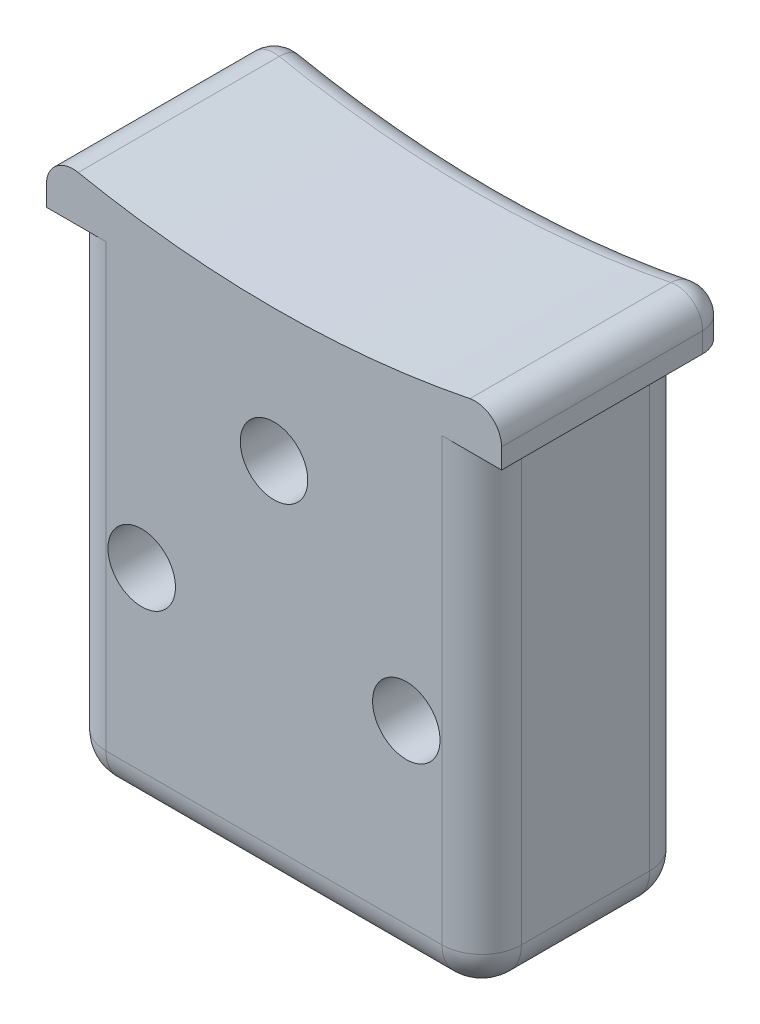
ISO-10303-21;
HEADER;
FILE_DESCRIPTION(('STEP AP214'),'2;1');
FILE_NAME('part.step','',(''),(''),'','','');
FILE_SCHEMA(('AUTOMOTIVE_DESIGN { 1 0 10303 214 1 1 1 1 }'));
ENDSEC;
DATA;
#1=APPLICATION_CONTEXT('core data for automotive mechanical design processes');
#2=APPLICATION_PROTOCOL_DEFINITION('international standard','automotive_design',2000,#1);
#3=PRODUCT_CONTEXT('',#1,'mechanical');
#4=PRODUCT('Part','Part','',(#3));
#5=PRODUCT_RELATED_PRODUCT_CATEGORY('part','',(#4));
#6=PRODUCT_DEFINITION_FORMATION('','',#4);
#7=PRODUCT_DEFINITION_CONTEXT('part definition',#1,'design');
#8=PRODUCT_DEFINITION('design','',#6,#7);
#9=PRODUCT_DEFINITION_SHAPE('','',#8);
#10=(LENGTH_UNIT() NAMED_UNIT(*) SI_UNIT(.MILLI.,.METRE.));
#11=(NAMED_UNIT(*) PLANE_ANGLE_UNIT() SI_UNIT($,.RADIAN.));
#12=(NAMED_UNIT(*) SI_UNIT($,.STERADIAN.) SOLID_ANGLE_UNIT());
#13=UNCERTAINTY_MEASURE_WITH_UNIT(LENGTH_MEASURE(1.E-05),#10,'distance_accuracy_value','');
#14=(GEOMETRIC_REPRESENTATION_CONTEXT(3) GLOBAL_UNCERTAINTY_ASSIGNED_CONTEXT((#13)) GLOBAL_UNIT_ASSIGNED_CONTEXT((#10,
#11,#12)) REPRESENTATION_CONTEXT('',''));
#15=CARTESIAN_POINT('',(0.,0.,0.));
#16=DIRECTION('',(0.,0.,1.));
#17=DIRECTION('',(1.,0.,0.));
#18=AXIS2_PLACEMENT_3D('',#15,#16,#17);
#19=CARTESIAN_POINT('',(0.,0.,-17.2));
#20=DIRECTION('',(0.,0.,-1.));
#21=DIRECTION('',(-1.,0.,0.));
#22=AXIS2_PLACEMENT_3D('',#19,#20,#21);
#23=PLANE('',#22);
#24=CARTESIAN_POINT('',(15.7,113.338325587649,-17.2));
#25=DIRECTION('',(0.,0.,-1.));
#26=DIRECTION('',(-1.,0.,0.));
#27=AXIS2_PLACEMENT_3D('',#24,#25,#26);
#28=CIRCLE('',#27,77.);
#29=CARTESIAN_POINT('',(15.7,36.3383255876489,-17.2));
#30=VERTEX_POINT('',#29);
#31=CARTESIAN_POINT('',(30.9,37.8534926740099,-17.2));
#32=VERTEX_POINT('',#31);
#33=EDGE_CURVE('E267',#30,#32,#28,.F.);
#34=ORIENTED_EDGE('',*,*,#33,.T.);
#35=DIRECTION('',(0.,-1.,0.));
#36=VECTOR('',#35,1.);
#37=CARTESIAN_POINT('',(30.9,0.,-17.2));
#38=LINE('',#37,#36);
#39=CARTESIAN_POINT('',(30.9,36.3383255876489,-17.2));
#40=VERTEX_POINT('',#39);
#41=EDGE_CURVE('E269',#32,#40,#38,.T.);
#42=ORIENTED_EDGE('',*,*,#41,.T.);
#43=DIRECTION('',(1.,0.,0.));
#44=VECTOR('',#43,1.);
#45=CARTESIAN_POINT('',(0.,36.3383255876489,-17.2));
#46=LINE('',#45,#44);
#47=EDGE_CURVE('E230',#30,#40,#46,.T.);
#48=ORIENTED_EDGE('',*,*,#47,.F.);
#49=EDGE_LOOP('',(#34,#42,#48));
#50=FACE_BOUND('',#49,.T.);
#51=ADVANCED_FACE('F58',(#50),#23,.T.);
#52=CARTESIAN_POINT('',(0.,40.,-15.7));
#53=DIRECTION('',(0.,0.,-1.));
#54=DIRECTION('',(-1.,0.,0.));
#55=AXIS2_PLACEMENT_3D('',#52,#53,#54);
#56=PLANE('',#55);
#57=CARTESIAN_POINT('',(25.7,16.3383255876489,-15.7));
#58=DIRECTION('',(0.,0.,-1.));
#59=DIRECTION('',(-1.,0.,0.));
#60=AXIS2_PLACEMENT_3D('',#57,#58,#59);
#61=CIRCLE('',#60,2.55);
#62=CARTESIAN_POINT('',(23.15,16.3383255876489,-15.7));
#63=VERTEX_POINT('',#62);
#64=EDGE_CURVE('E237',#63,#63,#61,.T.);
#65=ORIENTED_EDGE('',*,*,#64,.F.);
#66=EDGE_LOOP('',(#65));
#67=FACE_BOUND('',#66,.T.);
#68=CARTESIAN_POINT('',(5.69999999999999,16.3383255876489,-15.7));
#69=DIRECTION('',(0.,0.,-1.));
#70=DIRECTION('',(-1.,0.,0.));
#71=AXIS2_PLACEMENT_3D('',#68,#69,#70);
#72=CIRCLE('',#71,2.55);
#73=CARTESIAN_POINT('',(3.15,16.3383255876489,-15.7));
#74=VERTEX_POINT('',#73);
#75=EDGE_CURVE('E241',#74,#74,#72,.T.);
#76=ORIENTED_EDGE('',*,*,#75,.F.);
#77=EDGE_LOOP('',(#76));
#78=FACE_BOUND('',#77,.T.);
#79=CARTESIAN_POINT('',(15.7,28.3383255876489,-15.7));
#80=DIRECTION('',(0.,0.,-1.));
#81=DIRECTION('',(-1.,0.,0.));
#82=AXIS2_PLACEMENT_3D('',#79,#80,#81);
#83=CIRCLE('',#82,2.55);
#84=CARTESIAN_POINT('',(13.15,28.3383255876489,-15.7));
#85=VERTEX_POINT('',#84);
#86=EDGE_CURVE('E234',#85,#85,#83,.T.);
#87=ORIENTED_EDGE('',*,*,#86,.F.);
#88=EDGE_LOOP('',(#87));
#89=FACE_BOUND('',#88,.T.);
#90=DIRECTION('',(1.,0.,0.));
#91=VECTOR('',#90,1.);
#92=CARTESIAN_POINT('',(0.,3.,-15.7));
#93=LINE('',#92,#91);
#94=CARTESIAN_POINT('',(28.4,3.,-15.7));
#95=VERTEX_POINT('',#94);
#96=CARTESIAN_POINT('',(3.,3.,-15.7));
#97=VERTEX_POINT('',#96);
#98=EDGE_CURVE('E310',#95,#97,#93,.F.);
#99=ORIENTED_EDGE('',*,*,#98,.T.);
#100=DIRECTION('',(0.,-1.,0.));
#101=VECTOR('',#100,1.);
#102=CARTESIAN_POINT('',(3.,40.,-15.7));
#103=LINE('',#102,#101);
#104=CARTESIAN_POINT('',(3.,36.3383255876489,-15.7));
#105=VERTEX_POINT('',#104);
#106=EDGE_CURVE('E312',#97,#105,#103,.F.);
#107=ORIENTED_EDGE('',*,*,#106,.T.);
#108=DIRECTION('',(1.,0.,0.));
#109=VECTOR('',#108,1.);
#110=CARTESIAN_POINT('',(0.,36.3383255876489,-15.7));
#111=LINE('',#110,#109);
#112=CARTESIAN_POINT('',(28.4,36.3383255876489,-15.7));
#113=VERTEX_POINT('',#112);
#114=EDGE_CURVE('E231',#105,#113,#111,.T.);
#115=ORIENTED_EDGE('',*,*,#114,.T.);
#116=DIRECTION('',(0.,-1.,0.));
#117=VECTOR('',#116,1.);
#118=CARTESIAN_POINT('',(28.4,0.,-15.7));
#119=LINE('',#118,#117);
#120=EDGE_CURVE('E308',#113,#95,#119,.T.);
#121=ORIENTED_EDGE('',*,*,#120,.T.);
#122=EDGE_LOOP('',(#99,#107,#115,#121));
#123=FACE_BOUND('',#122,.T.);
#124=ADVANCED_FACE('F463',(#67,#78,#89,#123),#56,.T.);
#125=CARTESIAN_POINT('',(0.,40.,0.));
#126=DIRECTION('',(-1.,0.,0.));
#127=DIRECTION('',(0.,0.,1.));
#128=AXIS2_PLACEMENT_3D('',#125,#126,#127);
#129=PLANE('',#128);
#130=DIRECTION('',(0.,0.,-1.));
#131=VECTOR('',#130,1.);
#132=CARTESIAN_POINT('',(0.,36.3383255876489,2.45671245254708));
#133=LINE('',#132,#131);
#134=CARTESIAN_POINT('',(0.,36.3383255876489,-3.));
#135=VERTEX_POINT('',#134);
#136=CARTESIAN_POINT('',(0.,36.3383255876489,-12.7));
#137=VERTEX_POINT('',#136);
#138=EDGE_CURVE('E208',#135,#137,#133,.T.);
#139=ORIENTED_EDGE('',*,*,#138,.T.);
#140=DIRECTION('',(0.,-1.,0.));
#141=VECTOR('',#140,1.);
#142=CARTESIAN_POINT('',(0.,40.,-12.7));
#143=LINE('',#142,#141);
#144=CARTESIAN_POINT('',(0.,3.,-12.7));
#145=VERTEX_POINT('',#144);
#146=EDGE_CURVE('E305',#137,#145,#143,.T.);
#147=ORIENTED_EDGE('',*,*,#146,.T.);
#148=DIRECTION('',(0.,0.,-1.));
#149=VECTOR('',#148,1.);
#150=CARTESIAN_POINT('',(0.,3.,0.));
#151=LINE('',#150,#149);
#152=CARTESIAN_POINT('',(0.,3.,-3.));
#153=VERTEX_POINT('',#152);
#154=EDGE_CURVE('E303',#145,#153,#151,.F.);
#155=ORIENTED_EDGE('',*,*,#154,.T.);
#156=DIRECTION('',(0.,-1.,0.));
#157=VECTOR('',#156,1.);
#158=CARTESIAN_POINT('',(0.,36.3383255876489,-3.));
#159=LINE('',#158,#157);
#160=EDGE_CURVE('E285',#153,#135,#159,.F.);
#161=ORIENTED_EDGE('',*,*,#160,.T.);
#162=EDGE_LOOP('',(#139,#147,#155,#161));
#163=FACE_BOUND('',#162,.T.);
#164=ADVANCED_FACE('F468',(#163),#129,.T.);
#165=CARTESIAN_POINT('',(0.,40.,0.));
#166=DIRECTION('',(0.,0.,-1.));
#167=DIRECTION('',(-1.,0.,0.));
#168=AXIS2_PLACEMENT_3D('',#165,#166,#167);
#169=PLANE('',#168);
#170=DIRECTION('',(1.,0.,0.));
#171=VECTOR('',#170,1.);
#172=CARTESIAN_POINT('',(0.,36.3383255876489,0.));
#173=LINE('',#172,#171);
#174=CARTESIAN_POINT('',(-1.5,36.3383255876489,0.));
#175=VERTEX_POINT('',#174);
#176=CARTESIAN_POINT('',(3.,36.3383255876489,0.));
#177=VERTEX_POINT('',#176);
#178=EDGE_CURVE('E191',#175,#177,#173,.T.);
#179=ORIENTED_EDGE('',*,*,#178,.T.);
#180=DIRECTION('',(0.,-1.,0.));
#181=VECTOR('',#180,1.);
#182=CARTESIAN_POINT('',(3.,0.,0.));
#183=LINE('',#182,#181);
#184=CARTESIAN_POINT('',(3.,3.,0.));
#185=VERTEX_POINT('',#184);
#186=EDGE_CURVE('E328',#177,#185,#183,.T.);
#187=ORIENTED_EDGE('',*,*,#186,.T.);
#188=DIRECTION('',(1.,0.,0.));
#189=VECTOR('',#188,1.);
#190=CARTESIAN_POINT('',(0.,3.,0.));
#191=LINE('',#190,#189);
#192=CARTESIAN_POINT('',(28.4,3.,0.));
#193=VERTEX_POINT('',#192);
#194=EDGE_CURVE('E326',#185,#193,#191,.T.);
#195=ORIENTED_EDGE('',*,*,#194,.T.);
#196=DIRECTION('',(0.,-1.,0.));
#197=VECTOR('',#196,1.);
#198=CARTESIAN_POINT('',(28.4,40.,0.));
#199=LINE('',#198,#197);
#200=CARTESIAN_POINT('',(28.4,36.3383255876489,0.));
#201=VERTEX_POINT('',#200);
#202=EDGE_CURVE('E323',#193,#201,#199,.F.);
#203=ORIENTED_EDGE('',*,*,#202,.T.);
#204=DIRECTION('',(1.,0.,0.));
#205=VECTOR('',#204,1.);
#206=CARTESIAN_POINT('',(0.,36.3383255876489,0.));
#207=LINE('',#206,#205);
#208=CARTESIAN_POINT('',(32.9,36.3383255876489,0.));
#209=VERTEX_POINT('',#208);
#210=EDGE_CURVE('E226',#201,#209,#207,.T.);
#211=ORIENTED_EDGE('',*,*,#210,.T.);
#212=DIRECTION('',(0.,-1.,0.));
#213=VECTOR('',#212,1.);
#214=CARTESIAN_POINT('',(32.9,0.,0.));
#215=LINE('',#214,#213);
#216=CARTESIAN_POINT('',(32.9,37.8534926740099,0.));
#217=VERTEX_POINT('',#216);
#218=EDGE_CURVE('E199',#217,#209,#215,.T.);
#219=ORIENTED_EDGE('',*,*,#218,.F.);
#220=CARTESIAN_POINT('',(30.9,37.8534926740099,0.));
#221=DIRECTION('',(0.,0.,-1.));
#222=DIRECTION('',(-1.,0.,0.));
#223=AXIS2_PLACEMENT_3D('',#220,#221,#222);
#224=CIRCLE('',#223,2.);
#225=CARTESIAN_POINT('',(30.5051948051948,39.8141376847537,0.));
#226=VERTEX_POINT('',#225);
#227=EDGE_CURVE('E276',#217,#226,#224,.F.);
#228=ORIENTED_EDGE('',*,*,#227,.T.);
#229=CARTESIAN_POINT('',(15.7,113.338325587649,0.));
#230=DIRECTION('',(0.,0.,-1.));
#231=DIRECTION('',(-1.,0.,0.));
#232=AXIS2_PLACEMENT_3D('',#229,#230,#231);
#233=CIRCLE('',#232,75.);
#234=CARTESIAN_POINT('',(0.89480519480519,39.8141376847537,0.));
#235=VERTEX_POINT('',#234);
#236=EDGE_CURVE('E246',#226,#235,#233,.T.);
#237=ORIENTED_EDGE('',*,*,#236,.T.);
#238=CARTESIAN_POINT('',(0.499999999999999,37.8534926740099,0.));
#239=DIRECTION('',(0.,0.,-1.));
#240=DIRECTION('',(-1.,0.,0.));
#241=AXIS2_PLACEMENT_3D('',#238,#239,#240);
#242=CIRCLE('',#241,2.);
#243=CARTESIAN_POINT('',(-1.5,37.8534926740099,0.));
#244=VERTEX_POINT('',#243);
#245=EDGE_CURVE('E195',#235,#244,#242,.F.);
#246=ORIENTED_EDGE('',*,*,#245,.T.);
#247=DIRECTION('',(0.,-1.,0.));
#248=VECTOR('',#247,1.);
#249=CARTESIAN_POINT('',(-1.5,0.,0.));
#250=LINE('',#249,#248);
#251=EDGE_CURVE('E186',#244,#175,#250,.T.);
#252=ORIENTED_EDGE('',*,*,#251,.T.);
#253=EDGE_LOOP('',(#179,#187,#195,#203,#211,#219,#228,#237,#246,#252));
#254=FACE_BOUND('',#253,.T.);
#255=CARTESIAN_POINT('',(25.7,16.3383255876489,0.));
#256=DIRECTION('',(0.,0.,-1.));
#257=DIRECTION('',(-1.,0.,0.));
#258=AXIS2_PLACEMENT_3D('',#255,#256,#257);
#259=CIRCLE('',#258,2.55);
#260=CARTESIAN_POINT('',(23.15,16.3383255876489,0.));
#261=VERTEX_POINT('',#260);
#262=EDGE_CURVE('E248',#261,#261,#259,.T.);
#263=ORIENTED_EDGE('',*,*,#262,.T.);
#264=EDGE_LOOP('',(#263));
#265=FACE_BOUND('',#264,.T.);
#266=CARTESIAN_POINT('',(5.69999999999999,16.3383255876489,0.));
#267=DIRECTION('',(0.,0.,-1.));
#268=DIRECTION('',(-1.,0.,0.));
#269=AXIS2_PLACEMENT_3D('',#266,#267,#268);
#270=CIRCLE('',#269,2.55);
#271=CARTESIAN_POINT('',(3.15,16.3383255876489,0.));
#272=VERTEX_POINT('',#271);
#273=EDGE_CURVE('E252',#272,#272,#270,.T.);
#274=ORIENTED_EDGE('',*,*,#273,.T.);
#275=EDGE_LOOP('',(#274));
#276=FACE_BOUND('',#275,.T.);
#277=CARTESIAN_POINT('',(15.7,28.3383255876489,0.));
#278=DIRECTION('',(0.,0.,-1.));
#279=DIRECTION('',(-1.,0.,0.));
#280=AXIS2_PLACEMENT_3D('',#277,#278,#279);
#281=CIRCLE('',#280,2.55);
#282=CARTESIAN_POINT('',(13.15,28.3383255876489,0.));
#283=VERTEX_POINT('',#282);
#284=EDGE_CURVE('E240',#283,#283,#281,.T.);
#285=ORIENTED_EDGE('',*,*,#284,.T.);
#286=EDGE_LOOP('',(#285));
#287=FACE_BOUND('',#286,.T.);
#288=ADVANCED_FACE('F188',(#254,#265,#276,#287),#169,.F.);
#289=CARTESIAN_POINT('',(31.4,40.,0.));
#290=DIRECTION('',(-1.,0.,0.));
#291=DIRECTION('',(0.,0.,1.));
#292=AXIS2_PLACEMENT_3D('',#289,#290,#291);
#293=PLANE('',#292);
#294=DIRECTION('',(0.,0.,-1.));
#295=VECTOR('',#294,1.);
#296=CARTESIAN_POINT('',(31.4,3.,0.));
#297=LINE('',#296,#295);
#298=CARTESIAN_POINT('',(31.4,3.,-3.));
#299=VERTEX_POINT('',#298);
#300=CARTESIAN_POINT('',(31.4,3.,-12.7));
#301=VERTEX_POINT('',#300);
#302=EDGE_CURVE('E75',#299,#301,#297,.T.);
#303=ORIENTED_EDGE('',*,*,#302,.T.);
#304=DIRECTION('',(0.,-1.,0.));
#305=VECTOR('',#304,1.);
#306=CARTESIAN_POINT('',(31.4,36.3383255876489,-12.7));
#307=LINE('',#306,#305);
#308=CARTESIAN_POINT('',(31.4,36.3383255876489,-12.7));
#309=VERTEX_POINT('',#308);
#310=EDGE_CURVE('E332',#301,#309,#307,.F.);
#311=ORIENTED_EDGE('',*,*,#310,.T.);
#312=DIRECTION('',(0.,0.,-1.));
#313=VECTOR('',#312,1.);
#314=CARTESIAN_POINT('',(31.4,36.3383255876489,2.45671245254708));
#315=LINE('',#314,#313);
#316=CARTESIAN_POINT('',(31.4,36.3383255876489,-3.));
#317=VERTEX_POINT('',#316);
#318=EDGE_CURVE('E219',#317,#309,#315,.T.);
#319=ORIENTED_EDGE('',*,*,#318,.F.);
#320=DIRECTION('',(0.,-1.,0.));
#321=VECTOR('',#320,1.);
#322=CARTESIAN_POINT('',(31.4,40.,-3.));
#323=LINE('',#322,#321);
#324=EDGE_CURVE('E80',#317,#299,#323,.T.);
#325=ORIENTED_EDGE('',*,*,#324,.T.);
#326=EDGE_LOOP('',(#303,#311,#319,#325));
#327=FACE_BOUND('',#326,.T.);
#328=ADVANCED_FACE('F410',(#327),#293,.F.);
#329=CARTESIAN_POINT('',(0.,0.,0.));
#330=DIRECTION('',(0.,1.,0.));
#331=DIRECTION('',(0.,0.,1.));
#332=AXIS2_PLACEMENT_3D('',#329,#330,#331);
#333=PLANE('',#332);
#334=DIRECTION('',(1.,0.,0.));
#335=VECTOR('',#334,1.);
#336=CARTESIAN_POINT('',(0.,0.,-3.));
#337=LINE('',#336,#335);
#338=CARTESIAN_POINT('',(28.4,0.,-3.));
#339=VERTEX_POINT('',#338);
#340=CARTESIAN_POINT('',(3.,0.,-3.));
#341=VERTEX_POINT('',#340);
#342=EDGE_CURVE('E318',#339,#341,#337,.F.);
#343=ORIENTED_EDGE('',*,*,#342,.T.);
#344=DIRECTION('',(0.,0.,-1.));
#345=VECTOR('',#344,1.);
#346=CARTESIAN_POINT('',(3.,0.,-15.7));
#347=LINE('',#346,#345);
#348=CARTESIAN_POINT('',(3.,0.,-12.7));
#349=VERTEX_POINT('',#348);
#350=EDGE_CURVE('E320',#341,#349,#347,.T.);
#351=ORIENTED_EDGE('',*,*,#350,.T.);
#352=DIRECTION('',(1.,0.,0.));
#353=VECTOR('',#352,1.);
#354=CARTESIAN_POINT('',(31.4,0.,-12.7));
#355=LINE('',#354,#353);
#356=CARTESIAN_POINT('',(28.4,0.,-12.7));
#357=VERTEX_POINT('',#356);
#358=EDGE_CURVE('E316',#349,#357,#355,.T.);
#359=ORIENTED_EDGE('',*,*,#358,.T.);
#360=DIRECTION('',(0.,0.,-1.));
#361=VECTOR('',#360,1.);
#362=CARTESIAN_POINT('',(28.4,0.,0.));
#363=LINE('',#362,#361);
#364=EDGE_CURVE('E314',#357,#339,#363,.F.);
#365=ORIENTED_EDGE('',*,*,#364,.T.);
#366=EDGE_LOOP('',(#343,#351,#359,#365));
#367=FACE_BOUND('',#366,.T.);
#368=ADVANCED_FACE('F396',(#367),#333,.F.);
#369=CARTESIAN_POINT('',(15.7,113.338325587649,0.));
#370=DIRECTION('',(0.,0.,-1.));
#371=DIRECTION('',(-1.,0.,0.));
#372=AXIS2_PLACEMENT_3D('',#369,#370,#371);
#373=CYLINDRICAL_SURFACE('',#372,75.);
#374=ORIENTED_EDGE('',*,*,#236,.F.);
#375=DIRECTION('',(0.,0.,-1.));
#376=VECTOR('',#375,1.);
#377=CARTESIAN_POINT('',(30.5051948051948,39.8141376847537,0.));
#378=LINE('',#377,#376);
#379=CARTESIAN_POINT('',(30.5051948051948,39.8141376847537,-15.2));
#380=VERTEX_POINT('',#379);
#381=EDGE_CURVE('E261',#226,#380,#378,.T.);
#382=ORIENTED_EDGE('',*,*,#381,.T.);
#383=CARTESIAN_POINT('',(15.7,113.338325587649,-15.2));
#384=DIRECTION('',(0.,0.,-1.));
#385=DIRECTION('',(-1.,0.,0.));
#386=AXIS2_PLACEMENT_3D('',#383,#384,#385);
#387=CIRCLE('',#386,75.);
#388=CARTESIAN_POINT('',(0.894805194805193,39.8141376847537,-15.2));
#389=VERTEX_POINT('',#388);
#390=EDGE_CURVE('E258',#380,#389,#387,.T.);
#391=ORIENTED_EDGE('',*,*,#390,.T.);
#392=DIRECTION('',(0.,0.,-1.));
#393=VECTOR('',#392,1.);
#394=CARTESIAN_POINT('',(0.89480519480519,39.8141376847537,0.));
#395=LINE('',#394,#393);
#396=EDGE_CURVE('E198',#389,#235,#395,.F.);
#397=ORIENTED_EDGE('',*,*,#396,.T.);
#398=EDGE_LOOP('',(#374,#382,#391,#397));
#399=FACE_BOUND('',#398,.T.);
#400=ADVANCED_FACE('F432',(#399),#373,.F.);
#401=CARTESIAN_POINT('',(-1.5,0.,0.));
#402=DIRECTION('',(1.,0.,0.));
#403=DIRECTION('',(0.,0.,-1.));
#404=AXIS2_PLACEMENT_3D('',#401,#402,#403);
#405=PLANE('',#404);
#406=ORIENTED_EDGE('',*,*,#251,.F.);
#407=DIRECTION('',(0.,0.,-1.));
#408=VECTOR('',#407,1.);
#409=CARTESIAN_POINT('',(-1.5,37.8534926740099,0.));
#410=LINE('',#409,#408);
#411=CARTESIAN_POINT('',(-1.5,37.8534926740099,-15.2));
#412=VERTEX_POINT('',#411);
#413=EDGE_CURVE('E279',#244,#412,#410,.T.);
#414=ORIENTED_EDGE('',*,*,#413,.T.);
#415=DIRECTION('',(0.,-1.,0.));
#416=VECTOR('',#415,1.);
#417=CARTESIAN_POINT('',(-1.5,36.3383255876489,-15.2));
#418=LINE('',#417,#416);
#419=CARTESIAN_POINT('',(-1.5,36.3383255876489,-15.2));
#420=VERTEX_POINT('',#419);
#421=EDGE_CURVE('E205',#412,#420,#418,.T.);
#422=ORIENTED_EDGE('',*,*,#421,.T.);
#423=DIRECTION('',(0.,0.,-1.));
#424=VECTOR('',#423,1.);
#425=CARTESIAN_POINT('',(-1.5,36.3383255876489,2.45671245254708));
#426=LINE('',#425,#424);
#427=EDGE_CURVE('E202',#175,#420,#426,.T.);
#428=ORIENTED_EDGE('',*,*,#427,.F.);
#429=EDGE_LOOP('',(#406,#414,#422,#428));
#430=FACE_BOUND('',#429,.T.);
#431=ADVANCED_FACE('F203',(#430),#405,.F.);
#432=CARTESIAN_POINT('',(32.9,0.,0.));
#433=DIRECTION('',(1.,0.,0.));
#434=DIRECTION('',(0.,0.,-1.));
#435=AXIS2_PLACEMENT_3D('',#432,#433,#434);
#436=PLANE('',#435);
#437=DIRECTION('',(0.,-1.,0.));
#438=VECTOR('',#437,1.);
#439=CARTESIAN_POINT('',(32.9,0.,-15.2));
#440=LINE('',#439,#438);
#441=CARTESIAN_POINT('',(32.9,36.3383255876489,-15.2));
#442=VERTEX_POINT('',#441);
#443=CARTESIAN_POINT('',(32.9,37.8534926740099,-15.2));
#444=VERTEX_POINT('',#443);
#445=EDGE_CURVE('E271',#442,#444,#440,.F.);
#446=ORIENTED_EDGE('',*,*,#445,.T.);
#447=DIRECTION('',(0.,0.,1.));
#448=VECTOR('',#447,1.);
#449=CARTESIAN_POINT('',(32.9,37.8534926740099,0.));
#450=LINE('',#449,#448);
#451=EDGE_CURVE('E273',#444,#217,#450,.T.);
#452=ORIENTED_EDGE('',*,*,#451,.T.);
#453=ORIENTED_EDGE('',*,*,#218,.T.);
#454=DIRECTION('',(0.,0.,-1.));
#455=VECTOR('',#454,1.);
#456=CARTESIAN_POINT('',(32.9,36.3383255876489,2.45671245254708));
#457=LINE('',#456,#455);
#458=EDGE_CURVE('E216',#209,#442,#457,.T.);
#459=ORIENTED_EDGE('',*,*,#458,.T.);
#460=EDGE_LOOP('',(#446,#452,#453,#459));
#461=FACE_BOUND('',#460,.T.);
#462=ADVANCED_FACE('F415',(#461),#436,.T.);
#463=DIRECTION('',(0.,-1.,0.));
#464=VECTOR('',#463,1.);
#465=CARTESIAN_POINT('',(0.499999999999999,40.3372297054637,-17.2));
#466=LINE('',#465,#464);
#467=CARTESIAN_POINT('',(0.499999999999999,36.3383255876489,-17.2));
#468=VERTEX_POINT('',#467);
#469=CARTESIAN_POINT('',(0.499999999999999,37.8534926740099,-17.2));
#470=VERTEX_POINT('',#469);
#471=EDGE_CURVE('E263',#468,#470,#466,.F.);
#472=ORIENTED_EDGE('',*,*,#471,.T.);
#473=CARTESIAN_POINT('',(15.7,113.338325587649,-17.2));
#474=DIRECTION('',(0.,0.,-1.));
#475=DIRECTION('',(-1.,0.,0.));
#476=AXIS2_PLACEMENT_3D('',#473,#474,#475);
#477=CIRCLE('',#476,77.);
#478=EDGE_CURVE('E265',#470,#30,#477,.F.);
#479=ORIENTED_EDGE('',*,*,#478,.T.);
#480=EDGE_CURVE('E235',#468,#30,#46,.T.);
#481=ORIENTED_EDGE('',*,*,#480,.F.);
#482=EDGE_LOOP('',(#472,#479,#481));
#483=FACE_BOUND('',#482,.T.);
#484=ADVANCED_FACE('F446',(#483),#23,.T.);
#485=CARTESIAN_POINT('',(15.7,28.3383255876489,6.80000000000001));
#486=DIRECTION('',(0.,0.,-1.));
#487=DIRECTION('',(-1.,0.,0.));
#488=AXIS2_PLACEMENT_3D('',#485,#486,#487);
#489=CYLINDRICAL_SURFACE('',#488,2.55);
#490=ORIENTED_EDGE('',*,*,#86,.T.);
#491=EDGE_LOOP('',(#490));
#492=FACE_BOUND('',#491,.T.);
#493=ORIENTED_EDGE('',*,*,#284,.F.);
#494=EDGE_LOOP('',(#493));
#495=FACE_BOUND('',#494,.T.);
#496=ADVANCED_FACE('F474',(#492,#495),#489,.F.);
#497=CARTESIAN_POINT('',(5.69999999999999,16.3383255876489,6.80000000000001));
#498=DIRECTION('',(0.,0.,-1.));
#499=DIRECTION('',(-1.,0.,0.));
#500=AXIS2_PLACEMENT_3D('',#497,#498,#499);
#501=CYLINDRICAL_SURFACE('',#500,2.55);
#502=ORIENTED_EDGE('',*,*,#75,.T.);
#503=EDGE_LOOP('',(#502));
#504=FACE_BOUND('',#503,.T.);
#505=ORIENTED_EDGE('',*,*,#273,.F.);
#506=EDGE_LOOP('',(#505));
#507=FACE_BOUND('',#506,.T.);
#508=ADVANCED_FACE('F479',(#504,#507),#501,.F.);
#509=CARTESIAN_POINT('',(25.7,16.3383255876489,6.80000000000001));
#510=DIRECTION('',(0.,0.,-1.));
#511=DIRECTION('',(-1.,0.,0.));
#512=AXIS2_PLACEMENT_3D('',#509,#510,#511);
#513=CYLINDRICAL_SURFACE('',#512,2.55);
#514=ORIENTED_EDGE('',*,*,#64,.T.);
#515=EDGE_LOOP('',(#514));
#516=FACE_BOUND('',#515,.T.);
#517=ORIENTED_EDGE('',*,*,#262,.F.);
#518=EDGE_LOOP('',(#517));
#519=FACE_BOUND('',#518,.T.);
#520=ADVANCED_FACE('F612',(#516,#519),#513,.F.);
#521=CARTESIAN_POINT('',(0.,36.3383255876489,-32.9831096066841));
#522=DIRECTION('',(0.,-1.,0.));
#523=DIRECTION('',(0.,0.,-1.));
#524=AXIS2_PLACEMENT_3D('',#521,#522,#523);
#525=PLANE('',#524);
#526=ORIENTED_EDGE('',*,*,#47,.T.);
#527=CARTESIAN_POINT('',(30.9,36.3383255876489,-15.2));
#528=DIRECTION('',(0.,-1.,0.));
#529=DIRECTION('',(0.,0.,-1.));
#530=AXIS2_PLACEMENT_3D('',#527,#528,#529);
#531=CIRCLE('',#530,2.);
#532=EDGE_CURVE('E283',#40,#442,#531,.T.);
#533=ORIENTED_EDGE('',*,*,#532,.T.);
#534=ORIENTED_EDGE('',*,*,#458,.F.);
#535=ORIENTED_EDGE('',*,*,#210,.F.);
#536=CARTESIAN_POINT('',(28.4,36.3383255876489,-3.));
#537=DIRECTION('',(0.,-1.,0.));
#538=DIRECTION('',(0.,0.,-1.));
#539=AXIS2_PLACEMENT_3D('',#536,#537,#538);
#540=CIRCLE('',#539,3.);
#541=EDGE_CURVE('E12',#201,#317,#540,.F.);
#542=ORIENTED_EDGE('',*,*,#541,.T.);
#543=ORIENTED_EDGE('',*,*,#318,.T.);
#544=CARTESIAN_POINT('',(28.4,36.3383255876489,-12.7));
#545=DIRECTION('',(0.,-1.,0.));
#546=DIRECTION('',(0.,0.,-1.));
#547=AXIS2_PLACEMENT_3D('',#544,#545,#546);
#548=CIRCLE('',#547,3.);
#549=EDGE_CURVE('E67',#309,#113,#548,.F.);
#550=ORIENTED_EDGE('',*,*,#549,.T.);
#551=ORIENTED_EDGE('',*,*,#114,.F.);
#552=CARTESIAN_POINT('',(3.,36.3383255876489,-12.7));
#553=DIRECTION('',(0.,-1.,0.));
#554=DIRECTION('',(0.,0.,-1.));
#555=AXIS2_PLACEMENT_3D('',#552,#553,#554);
#556=CIRCLE('',#555,3.);
#557=EDGE_CURVE('E334',#105,#137,#556,.F.);
#558=ORIENTED_EDGE('',*,*,#557,.T.);
#559=ORIENTED_EDGE('',*,*,#138,.F.);
#560=CARTESIAN_POINT('',(3.,36.3383255876489,-3.));
#561=DIRECTION('',(0.,-1.,0.));
#562=DIRECTION('',(0.,0.,-1.));
#563=AXIS2_PLACEMENT_3D('',#560,#561,#562);
#564=CIRCLE('',#563,3.);
#565=EDGE_CURVE('E214',#135,#177,#564,.F.);
#566=ORIENTED_EDGE('',*,*,#565,.T.);
#567=ORIENTED_EDGE('',*,*,#178,.F.);
#568=ORIENTED_EDGE('',*,*,#427,.T.);
#569=CARTESIAN_POINT('',(0.499999999999999,36.3383255876489,-15.2));
#570=DIRECTION('',(0.,-1.,0.));
#571=DIRECTION('',(0.,0.,-1.));
#572=AXIS2_PLACEMENT_3D('',#569,#570,#571);
#573=CIRCLE('',#572,2.);
#574=EDGE_CURVE('E281',#420,#468,#573,.T.);
#575=ORIENTED_EDGE('',*,*,#574,.T.);
#576=ORIENTED_EDGE('',*,*,#480,.T.);
#577=EDGE_LOOP('',(#526,#533,#534,#535,#542,#543,#550,#551,#558,#559,#566,#567,#568,#575,#576));
#578=FACE_BOUND('',#577,.T.);
#579=ADVANCED_FACE('F211',(#578),#525,.T.);
#580=CARTESIAN_POINT('',(30.9,0.,-15.2));
#581=DIRECTION('',(0.,-1.,0.));
#582=DIRECTION('',(0.,0.,-1.));
#583=AXIS2_PLACEMENT_3D('',#580,#581,#582);
#584=CYLINDRICAL_SURFACE('',#583,2.);
#585=ORIENTED_EDGE('',*,*,#532,.F.);
#586=ORIENTED_EDGE('',*,*,#41,.F.);
#587=CARTESIAN_POINT('',(30.9,37.8534926740099,-15.2));
#588=DIRECTION('',(0.,1.,0.));
#589=DIRECTION('',(0.,0.,1.));
#590=AXIS2_PLACEMENT_3D('',#587,#588,#589);
#591=CIRCLE('',#590,2.);
#592=EDGE_CURVE('E224',#444,#32,#591,.T.);
#593=ORIENTED_EDGE('',*,*,#592,.F.);
#594=ORIENTED_EDGE('',*,*,#445,.F.);
#595=EDGE_LOOP('',(#585,#586,#593,#594));
#596=FACE_BOUND('',#595,.T.);
#597=ADVANCED_FACE('F419',(#596),#584,.T.);
#598=CARTESIAN_POINT('',(30.9,37.8534926740099,0.));
#599=DIRECTION('',(0.,0.,-1.));
#600=DIRECTION('',(-1.,0.,0.));
#601=AXIS2_PLACEMENT_3D('',#598,#599,#600);
#602=CYLINDRICAL_SURFACE('',#601,2.);
#603=ORIENTED_EDGE('',*,*,#227,.F.);
#604=ORIENTED_EDGE('',*,*,#451,.F.);
#605=CARTESIAN_POINT('',(30.9,37.8534926740099,-15.2));
#606=DIRECTION('',(0.,0.,-1.));
#607=DIRECTION('',(-1.,0.,0.));
#608=AXIS2_PLACEMENT_3D('',#605,#606,#607);
#609=CIRCLE('',#608,2.);
#610=EDGE_CURVE('E297',#380,#444,#609,.T.);
#611=ORIENTED_EDGE('',*,*,#610,.F.);
#612=ORIENTED_EDGE('',*,*,#381,.F.);
#613=EDGE_LOOP('',(#603,#604,#611,#612));
#614=FACE_BOUND('',#613,.T.);
#615=ADVANCED_FACE('F429',(#614),#602,.T.);
#616=CARTESIAN_POINT('',(0.499999999999999,37.8534926740099,0.));
#617=DIRECTION('',(0.,0.,-1.));
#618=DIRECTION('',(-1.,0.,0.));
#619=AXIS2_PLACEMENT_3D('',#616,#617,#618);
#620=CYLINDRICAL_SURFACE('',#619,2.);
#621=ORIENTED_EDGE('',*,*,#245,.F.);
#622=ORIENTED_EDGE('',*,*,#396,.F.);
#623=CARTESIAN_POINT('',(0.499999999999999,37.8534926740099,-15.2));
#624=DIRECTION('',(0.,0.,-1.));
#625=DIRECTION('',(-1.,0.,0.));
#626=AXIS2_PLACEMENT_3D('',#623,#624,#625);
#627=CIRCLE('',#626,2.);
#628=EDGE_CURVE('E294',#412,#389,#627,.T.);
#629=ORIENTED_EDGE('',*,*,#628,.F.);
#630=ORIENTED_EDGE('',*,*,#413,.F.);
#631=EDGE_LOOP('',(#621,#622,#629,#630));
#632=FACE_BOUND('',#631,.T.);
#633=ADVANCED_FACE('F436',(#632),#620,.T.);
#634=CARTESIAN_POINT('',(0.499999999999999,0.,-15.2));
#635=DIRECTION('',(0.,1.,0.));
#636=DIRECTION('',(0.,0.,1.));
#637=AXIS2_PLACEMENT_3D('',#634,#635,#636);
#638=CYLINDRICAL_SURFACE('',#637,2.);
#639=ORIENTED_EDGE('',*,*,#574,.F.);
#640=ORIENTED_EDGE('',*,*,#421,.F.);
#641=CARTESIAN_POINT('',(0.499999999999999,37.8534926740099,-15.2));
#642=DIRECTION('',(0.,1.,0.));
#643=DIRECTION('',(-1.,0.,0.));
#644=AXIS2_PLACEMENT_3D('',#641,#642,#643);
#645=CIRCLE('',#644,2.);
#646=EDGE_CURVE('E291',#470,#412,#645,.T.);
#647=ORIENTED_EDGE('',*,*,#646,.F.);
#648=ORIENTED_EDGE('',*,*,#471,.F.);
#649=EDGE_LOOP('',(#639,#640,#647,#648));
#650=FACE_BOUND('',#649,.T.);
#651=ADVANCED_FACE('F439',(#650),#638,.T.);
#652=CARTESIAN_POINT('',(30.9,37.8534926740099,-15.2));
#653=DIRECTION('',(0.,0.,-1.));
#654=DIRECTION('',(0.,1.,0.));
#655=AXIS2_PLACEMENT_3D('',#652,#653,#654);
#656=SPHERICAL_SURFACE('',#655,2.);
#657=ORIENTED_EDGE('',*,*,#610,.T.);
#658=ORIENTED_EDGE('',*,*,#592,.T.);
#659=CARTESIAN_POINT('',(30.9,37.8534926740099,-15.2));
#660=DIRECTION('',(0.980322505371935,0.197402597402596,0.));
#661=DIRECTION('',(-0.197402597402596,0.980322505371936,0.));
#662=AXIS2_PLACEMENT_3D('',#659,#660,#661);
#663=CIRCLE('',#662,2.);
#664=EDGE_CURVE('E288',#380,#32,#663,.F.);
#665=ORIENTED_EDGE('',*,*,#664,.F.);
#666=EDGE_LOOP('',(#657,#658,#665));
#667=FACE_BOUND('',#666,.T.);
#668=ADVANCED_FACE('F424',(#667),#656,.T.);
#669=CARTESIAN_POINT('',(0.499999999999999,37.8534926740099,-15.2));
#670=DIRECTION('',(0.,0.,-1.));
#671=DIRECTION('',(0.,1.,0.));
#672=AXIS2_PLACEMENT_3D('',#669,#670,#671);
#673=SPHERICAL_SURFACE('',#672,2.);
#674=ORIENTED_EDGE('',*,*,#646,.T.);
#675=ORIENTED_EDGE('',*,*,#628,.T.);
#676=CARTESIAN_POINT('',(0.499999999999998,37.8534926740099,-15.2));
#677=DIRECTION('',(-0.980322505371935,0.197402597402598,0.));
#678=DIRECTION('',(-0.197402597402598,-0.980322505371935,0.));
#679=AXIS2_PLACEMENT_3D('',#676,#677,#678);
#680=CIRCLE('',#679,2.);
#681=EDGE_CURVE('E286',#470,#389,#680,.F.);
#682=ORIENTED_EDGE('',*,*,#681,.F.);
#683=EDGE_LOOP('',(#674,#675,#682));
#684=FACE_BOUND('',#683,.T.);
#685=ADVANCED_FACE('F453',(#684),#673,.T.);
#686=CARTESIAN_POINT('',(15.7,113.338325587649,-15.2));
#687=DIRECTION('',(0.,0.,-1.));
#688=DIRECTION('',(-1.,0.,0.));
#689=AXIS2_PLACEMENT_3D('',#686,#687,#688);
#690=TOROIDAL_SURFACE('',#689,77.,2.);
#691=ORIENTED_EDGE('',*,*,#33,.F.);
#692=ORIENTED_EDGE('',*,*,#478,.F.);
#693=ORIENTED_EDGE('',*,*,#681,.T.);
#694=ORIENTED_EDGE('',*,*,#390,.F.);
#695=ORIENTED_EDGE('',*,*,#664,.T.);
#696=EDGE_LOOP('',(#691,#692,#693,#694,#695));
#697=FACE_BOUND('',#696,.T.);
#698=ADVANCED_FACE('F451',(#697),#690,.T.);
#699=CARTESIAN_POINT('',(28.4,40.,-3.));
#700=DIRECTION('',(0.,-1.,0.));
#701=DIRECTION('',(0.,0.,-1.));
#702=AXIS2_PLACEMENT_3D('',#699,#700,#701);
#703=CYLINDRICAL_SURFACE('',#702,3.);
#704=CARTESIAN_POINT('',(28.4,3.,-3.));
#705=DIRECTION('',(0.,-1.,0.));
#706=DIRECTION('',(0.,0.,-1.));
#707=AXIS2_PLACEMENT_3D('',#704,#705,#706);
#708=CIRCLE('',#707,3.);
#709=EDGE_CURVE('E62',#299,#193,#708,.T.);
#710=ORIENTED_EDGE('',*,*,#709,.F.);
#711=ORIENTED_EDGE('',*,*,#324,.F.);
#712=ORIENTED_EDGE('',*,*,#541,.F.);
#713=ORIENTED_EDGE('',*,*,#202,.F.);
#714=EDGE_LOOP('',(#710,#711,#712,#713));
#715=FACE_BOUND('',#714,.T.);
#716=ADVANCED_FACE('F60',(#715),#703,.T.);
#717=CARTESIAN_POINT('',(28.4,3.,-3.));
#718=DIRECTION('',(0.,0.,1.));
#719=DIRECTION('',(0.,-1.,0.));
#720=AXIS2_PLACEMENT_3D('',#717,#718,#719);
#721=SPHERICAL_SURFACE('',#720,3.);
#722=CARTESIAN_POINT('',(28.4,3.,-3.));
#723=DIRECTION('',(0.,0.,1.));
#724=DIRECTION('',(1.,0.,0.));
#725=AXIS2_PLACEMENT_3D('',#722,#723,#724);
#726=CIRCLE('',#725,3.);
#727=EDGE_CURVE('E363',#299,#339,#726,.F.);
#728=ORIENTED_EDGE('',*,*,#727,.F.);
#729=ORIENTED_EDGE('',*,*,#709,.T.);
#730=CARTESIAN_POINT('',(28.4,3.,-3.));
#731=DIRECTION('',(1.,0.,0.));
#732=DIRECTION('',(0.,0.,-1.));
#733=AXIS2_PLACEMENT_3D('',#730,#731,#732);
#734=CIRCLE('',#733,3.);
#735=EDGE_CURVE('E365',#339,#193,#734,.F.);
#736=ORIENTED_EDGE('',*,*,#735,.F.);
#737=EDGE_LOOP('',(#728,#729,#736));
#738=FACE_BOUND('',#737,.T.);
#739=ADVANCED_FACE('F374',(#738),#721,.T.);
#740=CARTESIAN_POINT('',(3.,40.,-3.));
#741=DIRECTION('',(0.,1.,0.));
#742=DIRECTION('',(0.,0.,1.));
#743=AXIS2_PLACEMENT_3D('',#740,#741,#742);
#744=CYLINDRICAL_SURFACE('',#743,3.);
#745=ORIENTED_EDGE('',*,*,#565,.F.);
#746=ORIENTED_EDGE('',*,*,#160,.F.);
#747=CARTESIAN_POINT('',(3.,3.,-3.));
#748=DIRECTION('',(0.,-1.,0.));
#749=DIRECTION('',(1.,0.,0.));
#750=AXIS2_PLACEMENT_3D('',#747,#748,#749);
#751=CIRCLE('',#750,3.);
#752=EDGE_CURVE('E360',#185,#153,#751,.T.);
#753=ORIENTED_EDGE('',*,*,#752,.F.);
#754=ORIENTED_EDGE('',*,*,#186,.F.);
#755=EDGE_LOOP('',(#745,#746,#753,#754));
#756=FACE_BOUND('',#755,.T.);
#757=ADVANCED_FACE('F386',(#756),#744,.T.);
#758=CARTESIAN_POINT('',(0.,3.,-3.));
#759=DIRECTION('',(1.,0.,0.));
#760=DIRECTION('',(0.,0.,-1.));
#761=AXIS2_PLACEMENT_3D('',#758,#759,#760);
#762=CYLINDRICAL_SURFACE('',#761,3.);
#763=ORIENTED_EDGE('',*,*,#735,.T.);
#764=ORIENTED_EDGE('',*,*,#194,.F.);
#765=CARTESIAN_POINT('',(3.,3.,-3.));
#766=DIRECTION('',(-1.,0.,0.));
#767=DIRECTION('',(0.,0.,1.));
#768=AXIS2_PLACEMENT_3D('',#765,#766,#767);
#769=CIRCLE('',#768,3.);
#770=EDGE_CURVE('E357',#341,#185,#769,.T.);
#771=ORIENTED_EDGE('',*,*,#770,.F.);
#772=ORIENTED_EDGE('',*,*,#342,.F.);
#773=EDGE_LOOP('',(#763,#764,#771,#772));
#774=FACE_BOUND('',#773,.T.);
#775=ADVANCED_FACE('F382',(#774),#762,.T.);
#776=CARTESIAN_POINT('',(28.4,3.,0.));
#777=DIRECTION('',(0.,0.,-1.));
#778=DIRECTION('',(-1.,0.,0.));
#779=AXIS2_PLACEMENT_3D('',#776,#777,#778);
#780=CYLINDRICAL_SURFACE('',#779,3.);
#781=ORIENTED_EDGE('',*,*,#727,.T.);
#782=ORIENTED_EDGE('',*,*,#364,.F.);
#783=CARTESIAN_POINT('',(28.4,3.,-12.7));
#784=DIRECTION('',(0.,0.,-1.));
#785=DIRECTION('',(-1.,0.,0.));
#786=AXIS2_PLACEMENT_3D('',#783,#784,#785);
#787=CIRCLE('',#786,3.);
#788=EDGE_CURVE('E354',#301,#357,#787,.T.);
#789=ORIENTED_EDGE('',*,*,#788,.F.);
#790=ORIENTED_EDGE('',*,*,#302,.F.);
#791=EDGE_LOOP('',(#781,#782,#789,#790));
#792=FACE_BOUND('',#791,.T.);
#793=ADVANCED_FACE('F400',(#792),#780,.T.);
#794=CARTESIAN_POINT('',(28.4,40.,-12.7));
#795=DIRECTION('',(0.,1.,0.));
#796=DIRECTION('',(0.,0.,1.));
#797=AXIS2_PLACEMENT_3D('',#794,#795,#796);
#798=CYLINDRICAL_SURFACE('',#797,3.);
#799=ORIENTED_EDGE('',*,*,#549,.F.);
#800=ORIENTED_EDGE('',*,*,#310,.F.);
#801=CARTESIAN_POINT('',(28.4,3.,-12.7));
#802=DIRECTION('',(0.,-1.,0.));
#803=DIRECTION('',(1.,0.,0.));
#804=AXIS2_PLACEMENT_3D('',#801,#802,#803);
#805=CIRCLE('',#804,3.);
#806=EDGE_CURVE('E351',#95,#301,#805,.T.);
#807=ORIENTED_EDGE('',*,*,#806,.F.);
#808=ORIENTED_EDGE('',*,*,#120,.F.);
#809=EDGE_LOOP('',(#799,#800,#807,#808));
#810=FACE_BOUND('',#809,.T.);
#811=ADVANCED_FACE('F409',(#810),#798,.T.);
#812=CARTESIAN_POINT('',(3.,3.,-3.));
#813=DIRECTION('',(0.,0.,1.));
#814=DIRECTION('',(0.,-1.,0.));
#815=AXIS2_PLACEMENT_3D('',#812,#813,#814);
#816=SPHERICAL_SURFACE('',#815,3.);
#817=ORIENTED_EDGE('',*,*,#770,.T.);
#818=ORIENTED_EDGE('',*,*,#752,.T.);
#819=CARTESIAN_POINT('',(3.,3.,-3.));
#820=DIRECTION('',(0.,0.,1.));
#821=DIRECTION('',(1.,0.,0.));
#822=AXIS2_PLACEMENT_3D('',#819,#820,#821);
#823=CIRCLE('',#822,3.);
#824=EDGE_CURVE('E348',#341,#153,#823,.F.);
#825=ORIENTED_EDGE('',*,*,#824,.F.);
#826=EDGE_LOOP('',(#817,#818,#825));
#827=FACE_BOUND('',#826,.T.);
#828=ADVANCED_FACE('F388',(#827),#816,.T.);
#829=CARTESIAN_POINT('',(28.4,3.,-12.7));
#830=DIRECTION('',(1.,0.,0.));
#831=DIRECTION('',(0.,1.,0.));
#832=AXIS2_PLACEMENT_3D('',#829,#830,#831);
#833=SPHERICAL_SURFACE('',#832,3.);
#834=ORIENTED_EDGE('',*,*,#806,.T.);
#835=ORIENTED_EDGE('',*,*,#788,.T.);
#836=CARTESIAN_POINT('',(28.4,3.,-12.7));
#837=DIRECTION('',(1.,0.,0.));
#838=DIRECTION('',(0.,0.,-1.));
#839=AXIS2_PLACEMENT_3D('',#836,#837,#838);
#840=CIRCLE('',#839,3.);
#841=EDGE_CURVE('E345',#95,#357,#840,.F.);
#842=ORIENTED_EDGE('',*,*,#841,.F.);
#843=EDGE_LOOP('',(#834,#835,#842));
#844=FACE_BOUND('',#843,.T.);
#845=ADVANCED_FACE('F404',(#844),#833,.T.);
#846=CARTESIAN_POINT('',(3.,3.,0.));
#847=DIRECTION('',(0.,0.,1.));
#848=DIRECTION('',(1.,0.,0.));
#849=AXIS2_PLACEMENT_3D('',#846,#847,#848);
#850=CYLINDRICAL_SURFACE('',#849,3.);
#851=ORIENTED_EDGE('',*,*,#824,.T.);
#852=ORIENTED_EDGE('',*,*,#154,.F.);
#853=CARTESIAN_POINT('',(3.,3.,-12.7));
#854=DIRECTION('',(0.,0.,-1.));
#855=DIRECTION('',(-1.,0.,0.));
#856=AXIS2_PLACEMENT_3D('',#853,#854,#855);
#857=CIRCLE('',#856,3.);
#858=EDGE_CURVE('E342',#349,#145,#857,.T.);
#859=ORIENTED_EDGE('',*,*,#858,.F.);
#860=ORIENTED_EDGE('',*,*,#350,.F.);
#861=EDGE_LOOP('',(#851,#852,#859,#860));
#862=FACE_BOUND('',#861,.T.);
#863=ADVANCED_FACE('F393',(#862),#850,.T.);
#864=CARTESIAN_POINT('',(0.,3.,-12.7));
#865=DIRECTION('',(-1.,0.,0.));
#866=DIRECTION('',(0.,0.,1.));
#867=AXIS2_PLACEMENT_3D('',#864,#865,#866);
#868=CYLINDRICAL_SURFACE('',#867,3.);
#869=ORIENTED_EDGE('',*,*,#841,.T.);
#870=ORIENTED_EDGE('',*,*,#358,.F.);
#871=CARTESIAN_POINT('',(3.,3.,-12.7));
#872=DIRECTION('',(-1.,0.,0.));
#873=DIRECTION('',(0.,-1.,0.));
#874=AXIS2_PLACEMENT_3D('',#871,#872,#873);
#875=CIRCLE('',#874,3.);
#876=EDGE_CURVE('E340',#97,#349,#875,.T.);
#877=ORIENTED_EDGE('',*,*,#876,.F.);
#878=ORIENTED_EDGE('',*,*,#98,.F.);
#879=EDGE_LOOP('',(#869,#870,#877,#878));
#880=FACE_BOUND('',#879,.T.);
#881=ADVANCED_FACE('F728',(#880),#868,.T.);
#882=CARTESIAN_POINT('',(3.,3.,-12.7));
#883=DIRECTION('',(0.,-1.,0.));
#884=DIRECTION('',(1.,0.,0.));
#885=AXIS2_PLACEMENT_3D('',#882,#883,#884);
#886=SPHERICAL_SURFACE('',#885,3.);
#887=ORIENTED_EDGE('',*,*,#876,.T.);
#888=ORIENTED_EDGE('',*,*,#858,.T.);
#889=CARTESIAN_POINT('',(3.,3.,-12.7));
#890=DIRECTION('',(0.,-1.,0.));
#891=DIRECTION('',(0.,0.,-1.));
#892=AXIS2_PLACEMENT_3D('',#889,#890,#891);
#893=CIRCLE('',#892,3.);
#894=EDGE_CURVE('E338',#97,#145,#893,.F.);
#895=ORIENTED_EDGE('',*,*,#894,.F.);
#896=EDGE_LOOP('',(#887,#888,#895));
#897=FACE_BOUND('',#896,.T.);
#898=ADVANCED_FACE('F735',(#897),#886,.T.);
#899=CARTESIAN_POINT('',(3.,40.,-12.7));
#900=DIRECTION('',(0.,-1.,0.));
#901=DIRECTION('',(0.,0.,-1.));
#902=AXIS2_PLACEMENT_3D('',#899,#900,#901);
#903=CYLINDRICAL_SURFACE('',#902,3.);
#904=ORIENTED_EDGE('',*,*,#557,.F.);
#905=ORIENTED_EDGE('',*,*,#106,.F.);
#906=ORIENTED_EDGE('',*,*,#894,.T.);
#907=ORIENTED_EDGE('',*,*,#146,.F.);
#908=EDGE_LOOP('',(#904,#905,#906,#907));
#909=FACE_BOUND('',#908,.T.);
#910=ADVANCED_FACE('F733',(#909),#903,.T.);
#911=CLOSED_SHELL('',(#51,#124,#164,#288,#328,#368,#400,#431,#462,#484,#496,#508,#520,#579,#597,
#615,#633,#651,#668,#685,#698,#716,#739,#757,#775,#793,#811,#828,#845,#863,#881,#898,#910));
#912=MANIFOLD_SOLID_BREP('B2',#911);
#913=ADVANCED_BREP_SHAPE_REPRESENTATION('',(#18,#912),#14);
#914=SHAPE_DEFINITION_REPRESENTATION(#9,#913);
ENDSEC;
END-ISO-10303-21;
